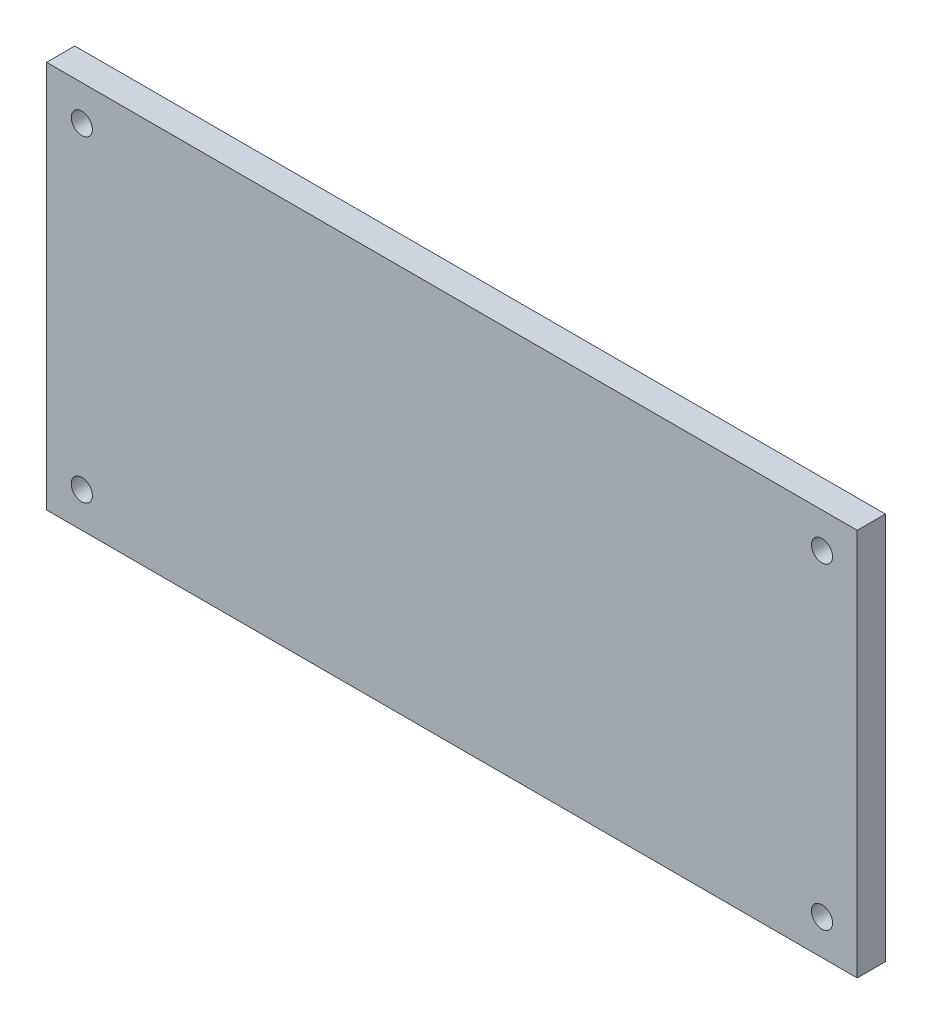
ISO-10303-21;
HEADER;
FILE_DESCRIPTION(('STEP AP214'),'2;1');
FILE_NAME('part.step','',(''),(''),'','','');
FILE_SCHEMA(('AUTOMOTIVE_DESIGN { 1 0 10303 214 1 1 1 1 }'));
ENDSEC;
DATA;
#1=APPLICATION_CONTEXT('core data for automotive mechanical design processes');
#2=APPLICATION_PROTOCOL_DEFINITION('international standard','automotive_design',2000,#1);
#3=PRODUCT_CONTEXT('',#1,'mechanical');
#4=PRODUCT('Part','Part','',(#3));
#5=PRODUCT_RELATED_PRODUCT_CATEGORY('part','',(#4));
#6=PRODUCT_DEFINITION_FORMATION('','',#4);
#7=PRODUCT_DEFINITION_CONTEXT('part definition',#1,'design');
#8=PRODUCT_DEFINITION('design','',#6,#7);
#9=PRODUCT_DEFINITION_SHAPE('','',#8);
#10=(LENGTH_UNIT() NAMED_UNIT(*) SI_UNIT(.MILLI.,.METRE.));
#11=(NAMED_UNIT(*) PLANE_ANGLE_UNIT() SI_UNIT($,.RADIAN.));
#12=(NAMED_UNIT(*) SI_UNIT($,.STERADIAN.) SOLID_ANGLE_UNIT());
#13=UNCERTAINTY_MEASURE_WITH_UNIT(LENGTH_MEASURE(1.E-05),#10,'distance_accuracy_value','');
#14=(GEOMETRIC_REPRESENTATION_CONTEXT(3) GLOBAL_UNCERTAINTY_ASSIGNED_CONTEXT((#13)) GLOBAL_UNIT_ASSIGNED_CONTEXT((#10,
#11,#12)) REPRESENTATION_CONTEXT('',''));
#15=CARTESIAN_POINT('',(0.,0.,0.));
#16=DIRECTION('',(0.,0.,1.));
#17=DIRECTION('',(1.,0.,0.));
#18=AXIS2_PLACEMENT_3D('',#15,#16,#17);
#19=CARTESIAN_POINT('',(115.,55.,8.));
#20=DIRECTION('',(-1.,0.,0.));
#21=DIRECTION('',(0.,-1.,0.));
#22=AXIS2_PLACEMENT_3D('',#19,#20,#21);
#23=PLANE('',#22);
#24=DIRECTION('',(0.,1.,0.));
#25=VECTOR('',#24,1.);
#26=CARTESIAN_POINT('',(115.,55.,0.));
#27=LINE('',#26,#25);
#28=CARTESIAN_POINT('',(115.,-55.,0.));
#29=VERTEX_POINT('',#28);
#30=CARTESIAN_POINT('',(115.,55.,0.));
#31=VERTEX_POINT('',#30);
#32=EDGE_CURVE('E98',#29,#31,#27,.T.);
#33=ORIENTED_EDGE('',*,*,#32,.T.);
#34=DIRECTION('',(0.,0.,-1.));
#35=VECTOR('',#34,1.);
#36=CARTESIAN_POINT('',(115.,55.,8.));
#37=LINE('',#36,#35);
#38=CARTESIAN_POINT('',(115.,55.,8.));
#39=VERTEX_POINT('',#38);
#40=EDGE_CURVE('E11',#39,#31,#37,.T.);
#41=ORIENTED_EDGE('',*,*,#40,.F.);
#42=DIRECTION('',(0.,1.,0.));
#43=VECTOR('',#42,1.);
#44=CARTESIAN_POINT('',(115.,55.,8.));
#45=LINE('',#44,#43);
#46=CARTESIAN_POINT('',(115.,-55.,8.));
#47=VERTEX_POINT('',#46);
#48=EDGE_CURVE('E86',#47,#39,#45,.T.);
#49=ORIENTED_EDGE('',*,*,#48,.F.);
#50=DIRECTION('',(0.,0.,-1.));
#51=VECTOR('',#50,1.);
#52=CARTESIAN_POINT('',(115.,-55.,8.));
#53=LINE('',#52,#51);
#54=EDGE_CURVE('E94',#47,#29,#53,.T.);
#55=ORIENTED_EDGE('',*,*,#54,.T.);
#56=EDGE_LOOP('',(#33,#41,#49,#55));
#57=FACE_BOUND('',#56,.T.);
#58=ADVANCED_FACE('F35',(#57),#23,.F.);
#59=CARTESIAN_POINT('',(-115.,55.,8.));
#60=DIRECTION('',(0.,-1.,0.));
#61=DIRECTION('',(0.,0.,-1.));
#62=AXIS2_PLACEMENT_3D('',#59,#60,#61);
#63=PLANE('',#62);
#64=DIRECTION('',(-1.,0.,0.));
#65=VECTOR('',#64,1.);
#66=CARTESIAN_POINT('',(-115.,55.,0.));
#67=LINE('',#66,#65);
#68=CARTESIAN_POINT('',(-115.,55.,0.));
#69=VERTEX_POINT('',#68);
#70=EDGE_CURVE('E90',#31,#69,#67,.T.);
#71=ORIENTED_EDGE('',*,*,#70,.T.);
#72=DIRECTION('',(0.,0.,-1.));
#73=VECTOR('',#72,1.);
#74=CARTESIAN_POINT('',(-115.,55.,8.));
#75=LINE('',#74,#73);
#76=CARTESIAN_POINT('',(-115.,55.,8.));
#77=VERTEX_POINT('',#76);
#78=EDGE_CURVE('E43',#77,#69,#75,.T.);
#79=ORIENTED_EDGE('',*,*,#78,.F.);
#80=DIRECTION('',(-1.,0.,0.));
#81=VECTOR('',#80,1.);
#82=CARTESIAN_POINT('',(-115.,55.,8.));
#83=LINE('',#82,#81);
#84=EDGE_CURVE('E81',#39,#77,#83,.T.);
#85=ORIENTED_EDGE('',*,*,#84,.F.);
#86=ORIENTED_EDGE('',*,*,#40,.T.);
#87=EDGE_LOOP('',(#71,#79,#85,#86));
#88=FACE_BOUND('',#87,.T.);
#89=ADVANCED_FACE('F89',(#88),#63,.F.);
#90=CARTESIAN_POINT('',(-115.,55.,8.));
#91=DIRECTION('',(1.,0.,0.));
#92=DIRECTION('',(0.,1.,0.));
#93=AXIS2_PLACEMENT_3D('',#90,#91,#92);
#94=PLANE('',#93);
#95=DIRECTION('',(0.,-1.,0.));
#96=VECTOR('',#95,1.);
#97=CARTESIAN_POINT('',(-115.,55.,0.));
#98=LINE('',#97,#96);
#99=CARTESIAN_POINT('',(-115.,-55.,0.));
#100=VERTEX_POINT('',#99);
#101=EDGE_CURVE('E68',#69,#100,#98,.T.);
#102=ORIENTED_EDGE('',*,*,#101,.T.);
#103=DIRECTION('',(0.,0.,-1.));
#104=VECTOR('',#103,1.);
#105=CARTESIAN_POINT('',(-115.,-55.,8.));
#106=LINE('',#105,#104);
#107=CARTESIAN_POINT('',(-115.,-55.,8.));
#108=VERTEX_POINT('',#107);
#109=EDGE_CURVE('E91',#108,#100,#106,.T.);
#110=ORIENTED_EDGE('',*,*,#109,.F.);
#111=DIRECTION('',(0.,-1.,0.));
#112=VECTOR('',#111,1.);
#113=CARTESIAN_POINT('',(-115.,55.,8.));
#114=LINE('',#113,#112);
#115=EDGE_CURVE('E84',#77,#108,#114,.T.);
#116=ORIENTED_EDGE('',*,*,#115,.F.);
#117=ORIENTED_EDGE('',*,*,#78,.T.);
#118=EDGE_LOOP('',(#102,#110,#116,#117));
#119=FACE_BOUND('',#118,.T.);
#120=ADVANCED_FACE('F92',(#119),#94,.F.);
#121=CARTESIAN_POINT('',(-115.,-55.,8.));
#122=DIRECTION('',(0.,1.,0.));
#123=DIRECTION('',(0.,0.,1.));
#124=AXIS2_PLACEMENT_3D('',#121,#122,#123);
#125=PLANE('',#124);
#126=DIRECTION('',(1.,0.,0.));
#127=VECTOR('',#126,1.);
#128=CARTESIAN_POINT('',(-115.,-55.,0.));
#129=LINE('',#128,#127);
#130=EDGE_CURVE('E74',#100,#29,#129,.T.);
#131=ORIENTED_EDGE('',*,*,#130,.T.);
#132=ORIENTED_EDGE('',*,*,#54,.F.);
#133=DIRECTION('',(1.,0.,0.));
#134=VECTOR('',#133,1.);
#135=CARTESIAN_POINT('',(-115.,-55.,8.));
#136=LINE('',#135,#134);
#137=EDGE_CURVE('E51',#108,#47,#136,.T.);
#138=ORIENTED_EDGE('',*,*,#137,.F.);
#139=ORIENTED_EDGE('',*,*,#109,.T.);
#140=EDGE_LOOP('',(#131,#132,#138,#139));
#141=FACE_BOUND('',#140,.T.);
#142=ADVANCED_FACE('F106',(#141),#125,.F.);
#143=CARTESIAN_POINT('',(0.,0.,8.));
#144=DIRECTION('',(0.,0.,1.));
#145=DIRECTION('',(1.,0.,0.));
#146=AXIS2_PLACEMENT_3D('',#143,#144,#145);
#147=PLANE('',#146);
#148=CARTESIAN_POINT('',(105.,45.,8.));
#149=DIRECTION('',(0.,0.,1.));
#150=DIRECTION('',(1.,0.,0.));
#151=AXIS2_PLACEMENT_3D('',#148,#149,#150);
#152=CIRCLE('',#151,3.00000000000001);
#153=CARTESIAN_POINT('',(108.,45.,8.));
#154=VERTEX_POINT('',#153);
#155=EDGE_CURVE('E122',#154,#154,#152,.T.);
#156=ORIENTED_EDGE('',*,*,#155,.F.);
#157=EDGE_LOOP('',(#156));
#158=FACE_BOUND('',#157,.T.);
#159=CARTESIAN_POINT('',(105.,-45.,8.));
#160=DIRECTION('',(0.,0.,1.));
#161=DIRECTION('',(1.,0.,0.));
#162=AXIS2_PLACEMENT_3D('',#159,#160,#161);
#163=CIRCLE('',#162,3.00000000000001);
#164=CARTESIAN_POINT('',(108.,-45.,8.));
#165=VERTEX_POINT('',#164);
#166=EDGE_CURVE('E121',#165,#165,#163,.T.);
#167=ORIENTED_EDGE('',*,*,#166,.F.);
#168=EDGE_LOOP('',(#167));
#169=FACE_BOUND('',#168,.T.);
#170=CARTESIAN_POINT('',(-105.,-45.,8.));
#171=DIRECTION('',(0.,0.,1.));
#172=DIRECTION('',(1.,0.,0.));
#173=AXIS2_PLACEMENT_3D('',#170,#171,#172);
#174=CIRCLE('',#173,3.00000000000001);
#175=CARTESIAN_POINT('',(-102.,-45.,8.));
#176=VERTEX_POINT('',#175);
#177=EDGE_CURVE('E128',#176,#176,#174,.T.);
#178=ORIENTED_EDGE('',*,*,#177,.F.);
#179=EDGE_LOOP('',(#178));
#180=FACE_BOUND('',#179,.T.);
#181=CARTESIAN_POINT('',(-105.,45.,8.));
#182=DIRECTION('',(0.,0.,1.));
#183=DIRECTION('',(1.,0.,0.));
#184=AXIS2_PLACEMENT_3D('',#181,#182,#183);
#185=CIRCLE('',#184,3.00000000000001);
#186=CARTESIAN_POINT('',(-102.,45.,8.));
#187=VERTEX_POINT('',#186);
#188=EDGE_CURVE('E114',#187,#187,#185,.T.);
#189=ORIENTED_EDGE('',*,*,#188,.F.);
#190=EDGE_LOOP('',(#189));
#191=FACE_BOUND('',#190,.T.);
#192=ORIENTED_EDGE('',*,*,#48,.T.);
#193=ORIENTED_EDGE('',*,*,#84,.T.);
#194=ORIENTED_EDGE('',*,*,#115,.T.);
#195=ORIENTED_EDGE('',*,*,#137,.T.);
#196=EDGE_LOOP('',(#192,#193,#194,#195));
#197=FACE_BOUND('',#196,.T.);
#198=ADVANCED_FACE('F82',(#158,#169,#180,#191,#197),#147,.T.);
#199=CARTESIAN_POINT('',(0.,0.,0.));
#200=DIRECTION('',(0.,0.,1.));
#201=DIRECTION('',(1.,0.,0.));
#202=AXIS2_PLACEMENT_3D('',#199,#200,#201);
#203=PLANE('',#202);
#204=CARTESIAN_POINT('',(105.,45.,0.));
#205=DIRECTION('',(0.,0.,1.));
#206=DIRECTION('',(1.,0.,0.));
#207=AXIS2_PLACEMENT_3D('',#204,#205,#206);
#208=CIRCLE('',#207,3.00000000000001);
#209=CARTESIAN_POINT('',(108.,45.,0.));
#210=VERTEX_POINT('',#209);
#211=EDGE_CURVE('E118',#210,#210,#208,.F.);
#212=ORIENTED_EDGE('',*,*,#211,.F.);
#213=EDGE_LOOP('',(#212));
#214=FACE_BOUND('',#213,.T.);
#215=CARTESIAN_POINT('',(105.,-45.,0.));
#216=DIRECTION('',(0.,0.,1.));
#217=DIRECTION('',(1.,0.,0.));
#218=AXIS2_PLACEMENT_3D('',#215,#216,#217);
#219=CIRCLE('',#218,3.00000000000001);
#220=CARTESIAN_POINT('',(108.,-45.,0.));
#221=VERTEX_POINT('',#220);
#222=EDGE_CURVE('E125',#221,#221,#219,.F.);
#223=ORIENTED_EDGE('',*,*,#222,.F.);
#224=EDGE_LOOP('',(#223));
#225=FACE_BOUND('',#224,.T.);
#226=CARTESIAN_POINT('',(-105.,-45.,0.));
#227=DIRECTION('',(0.,0.,1.));
#228=DIRECTION('',(1.,0.,0.));
#229=AXIS2_PLACEMENT_3D('',#226,#227,#228);
#230=CIRCLE('',#229,3.00000000000001);
#231=CARTESIAN_POINT('',(-102.,-45.,0.));
#232=VERTEX_POINT('',#231);
#233=EDGE_CURVE('E117',#232,#232,#230,.F.);
#234=ORIENTED_EDGE('',*,*,#233,.F.);
#235=EDGE_LOOP('',(#234));
#236=FACE_BOUND('',#235,.T.);
#237=CARTESIAN_POINT('',(-105.,45.,0.));
#238=DIRECTION('',(0.,0.,1.));
#239=DIRECTION('',(1.,0.,0.));
#240=AXIS2_PLACEMENT_3D('',#237,#238,#239);
#241=CIRCLE('',#240,3.00000000000001);
#242=CARTESIAN_POINT('',(-102.,45.,0.));
#243=VERTEX_POINT('',#242);
#244=EDGE_CURVE('E101',#243,#243,#241,.F.);
#245=ORIENTED_EDGE('',*,*,#244,.F.);
#246=EDGE_LOOP('',(#245));
#247=FACE_BOUND('',#246,.T.);
#248=ORIENTED_EDGE('',*,*,#32,.F.);
#249=ORIENTED_EDGE('',*,*,#130,.F.);
#250=ORIENTED_EDGE('',*,*,#101,.F.);
#251=ORIENTED_EDGE('',*,*,#70,.F.);
#252=EDGE_LOOP('',(#248,#249,#250,#251));
#253=FACE_BOUND('',#252,.T.);
#254=ADVANCED_FACE('F109',(#214,#225,#236,#247,#253),#203,.F.);
#255=CARTESIAN_POINT('',(-105.,45.,-8.48528137423859));
#256=DIRECTION('',(0.,0.,1.));
#257=DIRECTION('',(1.,0.,0.));
#258=AXIS2_PLACEMENT_3D('',#255,#256,#257);
#259=CYLINDRICAL_SURFACE('',#258,3.00000000000001);
#260=ORIENTED_EDGE('',*,*,#244,.T.);
#261=EDGE_LOOP('',(#260));
#262=FACE_BOUND('',#261,.T.);
#263=ORIENTED_EDGE('',*,*,#188,.T.);
#264=EDGE_LOOP('',(#263));
#265=FACE_BOUND('',#264,.T.);
#266=ADVANCED_FACE('F144',(#262,#265),#259,.F.);
#267=CARTESIAN_POINT('',(-105.,-45.,-8.48528137423859));
#268=DIRECTION('',(0.,0.,1.));
#269=DIRECTION('',(1.,0.,0.));
#270=AXIS2_PLACEMENT_3D('',#267,#268,#269);
#271=CYLINDRICAL_SURFACE('',#270,3.00000000000001);
#272=ORIENTED_EDGE('',*,*,#233,.T.);
#273=EDGE_LOOP('',(#272));
#274=FACE_BOUND('',#273,.T.);
#275=ORIENTED_EDGE('',*,*,#177,.T.);
#276=EDGE_LOOP('',(#275));
#277=FACE_BOUND('',#276,.T.);
#278=ADVANCED_FACE('F136',(#274,#277),#271,.F.);
#279=CARTESIAN_POINT('',(105.,-45.,-8.48528137423859));
#280=DIRECTION('',(0.,0.,1.));
#281=DIRECTION('',(1.,0.,0.));
#282=AXIS2_PLACEMENT_3D('',#279,#280,#281);
#283=CYLINDRICAL_SURFACE('',#282,3.00000000000001);
#284=ORIENTED_EDGE('',*,*,#222,.T.);
#285=EDGE_LOOP('',(#284));
#286=FACE_BOUND('',#285,.T.);
#287=ORIENTED_EDGE('',*,*,#166,.T.);
#288=EDGE_LOOP('',(#287));
#289=FACE_BOUND('',#288,.T.);
#290=ADVANCED_FACE('F152',(#286,#289),#283,.F.);
#291=CARTESIAN_POINT('',(105.,45.,-8.48528137423859));
#292=DIRECTION('',(0.,0.,1.));
#293=DIRECTION('',(1.,0.,0.));
#294=AXIS2_PLACEMENT_3D('',#291,#292,#293);
#295=CYLINDRICAL_SURFACE('',#294,3.00000000000001);
#296=ORIENTED_EDGE('',*,*,#211,.T.);
#297=EDGE_LOOP('',(#296));
#298=FACE_BOUND('',#297,.T.);
#299=ORIENTED_EDGE('',*,*,#155,.T.);
#300=EDGE_LOOP('',(#299));
#301=FACE_BOUND('',#300,.T.);
#302=ADVANCED_FACE('F199',(#298,#301),#295,.F.);
#303=CLOSED_SHELL('',(#58,#89,#120,#142,#198,#254,#266,#278,#290,#302));
#304=MANIFOLD_SOLID_BREP('B2',#303);
#305=ADVANCED_BREP_SHAPE_REPRESENTATION('',(#18,#304),#14);
#306=SHAPE_DEFINITION_REPRESENTATION(#9,#305);
ENDSEC;
END-ISO-10303-21;
